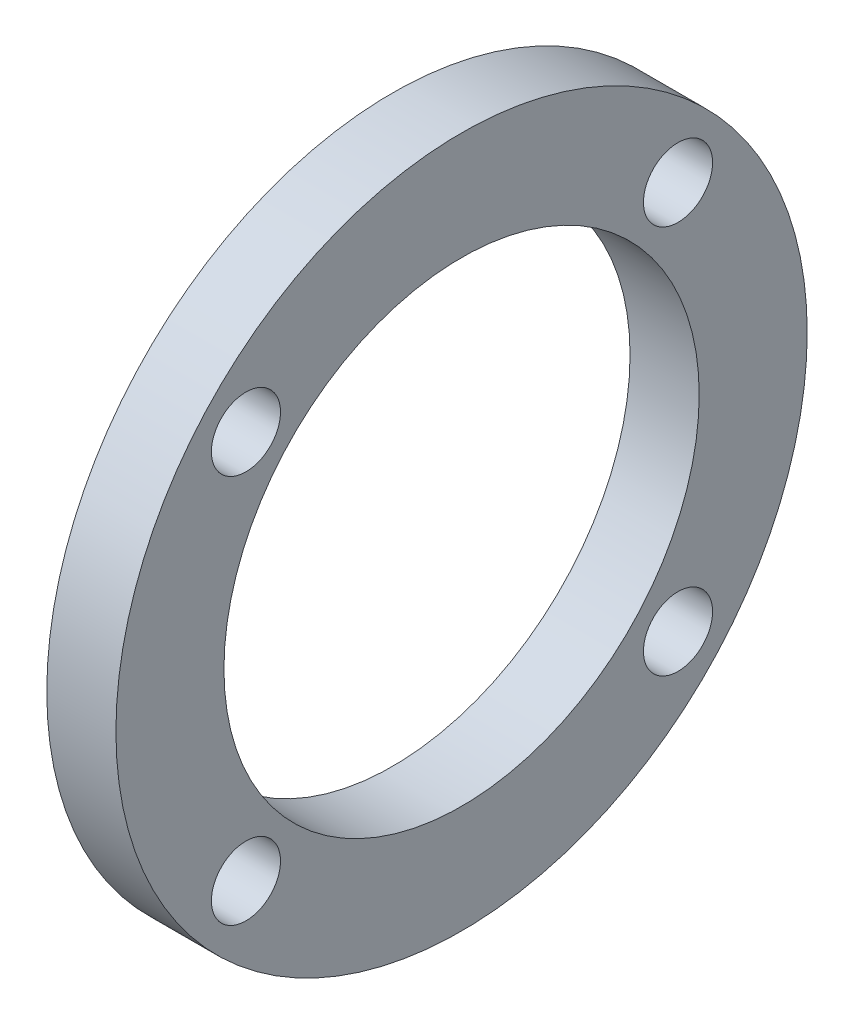
ISO-10303-21;
HEADER;
FILE_DESCRIPTION(('STEP AP214'),'2;1');
FILE_NAME('part.step','',(''),(''),'','','');
FILE_SCHEMA(('AUTOMOTIVE_DESIGN { 1 0 10303 214 1 1 1 1 }'));
ENDSEC;
DATA;
#1=APPLICATION_CONTEXT('core data for automotive mechanical design processes');
#2=APPLICATION_PROTOCOL_DEFINITION('international standard','automotive_design',2000,#1);
#3=PRODUCT_CONTEXT('',#1,'mechanical');
#4=PRODUCT('Part','Part','',(#3));
#5=PRODUCT_RELATED_PRODUCT_CATEGORY('part','',(#4));
#6=PRODUCT_DEFINITION_FORMATION('','',#4);
#7=PRODUCT_DEFINITION_CONTEXT('part definition',#1,'design');
#8=PRODUCT_DEFINITION('design','',#6,#7);
#9=PRODUCT_DEFINITION_SHAPE('','',#8);
#10=(LENGTH_UNIT() NAMED_UNIT(*) SI_UNIT(.MILLI.,.METRE.));
#11=(NAMED_UNIT(*) PLANE_ANGLE_UNIT() SI_UNIT($,.RADIAN.));
#12=(NAMED_UNIT(*) SI_UNIT($,.STERADIAN.) SOLID_ANGLE_UNIT());
#13=UNCERTAINTY_MEASURE_WITH_UNIT(LENGTH_MEASURE(1.E-05),#10,'distance_accuracy_value','');
#14=(GEOMETRIC_REPRESENTATION_CONTEXT(3) GLOBAL_UNCERTAINTY_ASSIGNED_CONTEXT((#13)) GLOBAL_UNIT_ASSIGNED_CONTEXT((#10,
#11,#12)) REPRESENTATION_CONTEXT('',''));
#15=CARTESIAN_POINT('',(0.,0.,0.));
#16=DIRECTION('',(0.,0.,1.));
#17=DIRECTION('',(1.,0.,0.));
#18=AXIS2_PLACEMENT_3D('',#15,#16,#17);
#19=CARTESIAN_POINT('',(8.,0.,0.));
#20=DIRECTION('',(1.,0.,0.));
#21=DIRECTION('',(0.,0.,-1.));
#22=AXIS2_PLACEMENT_3D('',#19,#20,#21);
#23=PLANE('',#22);
#24=CARTESIAN_POINT('',(8.,0.,0.));
#25=DIRECTION('',(1.,0.,0.));
#26=DIRECTION('',(0.,0.,-1.));
#27=AXIS2_PLACEMENT_3D('',#24,#25,#26);
#28=CIRCLE('',#27,27.5);
#29=CARTESIAN_POINT('',(8.,0.,-27.5));
#30=VERTEX_POINT('',#29);
#31=EDGE_CURVE('E87',#30,#30,#28,.T.);
#32=ORIENTED_EDGE('',*,*,#31,.F.);
#33=EDGE_LOOP('',(#32));
#34=FACE_BOUND('',#33,.T.);
#35=CARTESIAN_POINT('',(8.,22.5000000051948,-25.045842029834));
#36=DIRECTION('',(1.,0.,0.));
#37=DIRECTION('',(0.,0.,-1.));
#38=AXIS2_PLACEMENT_3D('',#35,#36,#37);
#39=CIRCLE('',#38,4.0000000015188);
#40=CARTESIAN_POINT('',(8.,22.5000000051948,-29.0458420313528));
#41=VERTEX_POINT('',#40);
#42=EDGE_CURVE('E72',#41,#41,#39,.F.);
#43=ORIENTED_EDGE('',*,*,#42,.T.);
#44=EDGE_LOOP('',(#43));
#45=FACE_BOUND('',#44,.T.);
#46=CARTESIAN_POINT('',(8.,22.5,24.954157970166));
#47=DIRECTION('',(1.,0.,0.));
#48=DIRECTION('',(0.,0.,-1.));
#49=AXIS2_PLACEMENT_3D('',#46,#47,#48);
#50=CIRCLE('',#49,4.);
#51=CARTESIAN_POINT('',(8.,22.5,20.954157970166));
#52=VERTEX_POINT('',#51);
#53=EDGE_CURVE('E55',#52,#52,#50,.F.);
#54=ORIENTED_EDGE('',*,*,#53,.T.);
#55=EDGE_LOOP('',(#54));
#56=FACE_BOUND('',#55,.T.);
#57=CARTESIAN_POINT('',(8.,0.,0.));
#58=DIRECTION('',(1.,0.,0.));
#59=DIRECTION('',(0.,0.,-1.));
#60=AXIS2_PLACEMENT_3D('',#57,#58,#59);
#61=CIRCLE('',#60,40.);
#62=CARTESIAN_POINT('',(8.,0.,-40.));
#63=VERTEX_POINT('',#62);
#64=EDGE_CURVE('E10',#63,#63,#61,.T.);
#65=ORIENTED_EDGE('',*,*,#64,.T.);
#66=EDGE_LOOP('',(#65));
#67=FACE_BOUND('',#66,.T.);
#68=CARTESIAN_POINT('',(8.,-22.5000000051948,-25.045842029834));
#69=DIRECTION('',(1.,0.,0.));
#70=DIRECTION('',(0.,0.,-1.));
#71=AXIS2_PLACEMENT_3D('',#68,#69,#70);
#72=CIRCLE('',#71,4.0000000015188);
#73=CARTESIAN_POINT('',(8.,-22.5000000051948,-29.0458420313528));
#74=VERTEX_POINT('',#73);
#75=EDGE_CURVE('E79',#74,#74,#72,.T.);
#76=ORIENTED_EDGE('',*,*,#75,.F.);
#77=EDGE_LOOP('',(#76));
#78=FACE_BOUND('',#77,.T.);
#79=CARTESIAN_POINT('',(8.,-22.5,24.954157970166));
#80=DIRECTION('',(1.,0.,0.));
#81=DIRECTION('',(0.,0.,-1.));
#82=AXIS2_PLACEMENT_3D('',#79,#80,#81);
#83=CIRCLE('',#82,4.);
#84=CARTESIAN_POINT('',(8.,-22.5,20.954157970166));
#85=VERTEX_POINT('',#84);
#86=EDGE_CURVE('E63',#85,#85,#83,.T.);
#87=ORIENTED_EDGE('',*,*,#86,.F.);
#88=EDGE_LOOP('',(#87));
#89=FACE_BOUND('',#88,.T.);
#90=ADVANCED_FACE('F40',(#34,#45,#56,#67,#78,#89),#23,.T.);
#91=CARTESIAN_POINT('',(0.,0.,0.));
#92=DIRECTION('',(1.,0.,0.));
#93=DIRECTION('',(0.,0.,-1.));
#94=AXIS2_PLACEMENT_3D('',#91,#92,#93);
#95=PLANE('',#94);
#96=CARTESIAN_POINT('',(0.,0.,0.));
#97=DIRECTION('',(1.,0.,0.));
#98=DIRECTION('',(0.,0.,-1.));
#99=AXIS2_PLACEMENT_3D('',#96,#97,#98);
#100=CIRCLE('',#99,27.5);
#101=CARTESIAN_POINT('',(0.,0.,-27.5));
#102=VERTEX_POINT('',#101);
#103=EDGE_CURVE('E83',#102,#102,#100,.T.);
#104=ORIENTED_EDGE('',*,*,#103,.T.);
#105=EDGE_LOOP('',(#104));
#106=FACE_BOUND('',#105,.T.);
#107=CARTESIAN_POINT('',(0.,22.5000000051948,-25.045842029834));
#108=DIRECTION('',(1.,0.,0.));
#109=DIRECTION('',(0.,0.,-1.));
#110=AXIS2_PLACEMENT_3D('',#107,#108,#109);
#111=CIRCLE('',#110,4.0000000015188);
#112=CARTESIAN_POINT('',(0.,22.5000000051948,-29.0458420313528));
#113=VERTEX_POINT('',#112);
#114=EDGE_CURVE('E59',#113,#113,#111,.F.);
#115=ORIENTED_EDGE('',*,*,#114,.F.);
#116=EDGE_LOOP('',(#115));
#117=FACE_BOUND('',#116,.T.);
#118=CARTESIAN_POINT('',(0.,-22.5000000051948,-25.045842029834));
#119=DIRECTION('',(1.,0.,0.));
#120=DIRECTION('',(0.,0.,-1.));
#121=AXIS2_PLACEMENT_3D('',#118,#119,#120);
#122=CIRCLE('',#121,4.0000000015188);
#123=CARTESIAN_POINT('',(0.,-22.5000000051948,-29.0458420313528));
#124=VERTEX_POINT('',#123);
#125=EDGE_CURVE('E68',#124,#124,#122,.T.);
#126=ORIENTED_EDGE('',*,*,#125,.T.);
#127=EDGE_LOOP('',(#126));
#128=FACE_BOUND('',#127,.T.);
#129=CARTESIAN_POINT('',(0.,22.5,24.954157970166));
#130=DIRECTION('',(1.,0.,0.));
#131=DIRECTION('',(0.,0.,-1.));
#132=AXIS2_PLACEMENT_3D('',#129,#130,#131);
#133=CIRCLE('',#132,4.);
#134=CARTESIAN_POINT('',(0.,22.5,20.954157970166));
#135=VERTEX_POINT('',#134);
#136=EDGE_CURVE('E53',#135,#135,#133,.F.);
#137=ORIENTED_EDGE('',*,*,#136,.F.);
#138=EDGE_LOOP('',(#137));
#139=FACE_BOUND('',#138,.T.);
#140=CARTESIAN_POINT('',(0.,0.,0.));
#141=DIRECTION('',(1.,0.,0.));
#142=DIRECTION('',(0.,0.,-1.));
#143=AXIS2_PLACEMENT_3D('',#140,#141,#142);
#144=CIRCLE('',#143,40.);
#145=CARTESIAN_POINT('',(0.,0.,-40.));
#146=VERTEX_POINT('',#145);
#147=EDGE_CURVE('E44',#146,#146,#144,.T.);
#148=ORIENTED_EDGE('',*,*,#147,.F.);
#149=EDGE_LOOP('',(#148));
#150=FACE_BOUND('',#149,.T.);
#151=CARTESIAN_POINT('',(0.,-22.5,24.954157970166));
#152=DIRECTION('',(1.,0.,0.));
#153=DIRECTION('',(0.,0.,-1.));
#154=AXIS2_PLACEMENT_3D('',#151,#152,#153);
#155=CIRCLE('',#154,4.);
#156=CARTESIAN_POINT('',(0.,-22.5,20.954157970166));
#157=VERTEX_POINT('',#156);
#158=EDGE_CURVE('E67',#157,#157,#155,.T.);
#159=ORIENTED_EDGE('',*,*,#158,.T.);
#160=EDGE_LOOP('',(#159));
#161=FACE_BOUND('',#160,.T.);
#162=ADVANCED_FACE('F95',(#106,#117,#128,#139,#150,#161),#95,.F.);
#163=CARTESIAN_POINT('',(8.,0.,0.));
#164=DIRECTION('',(-1.,0.,0.));
#165=DIRECTION('',(0.,0.,1.));
#166=AXIS2_PLACEMENT_3D('',#163,#164,#165);
#167=CYLINDRICAL_SURFACE('',#166,40.);
#168=ORIENTED_EDGE('',*,*,#64,.F.);
#169=EDGE_LOOP('',(#168));
#170=FACE_BOUND('',#169,.T.);
#171=ORIENTED_EDGE('',*,*,#147,.T.);
#172=EDGE_LOOP('',(#171));
#173=FACE_BOUND('',#172,.T.);
#174=ADVANCED_FACE('F42',(#170,#173),#167,.T.);
#175=CARTESIAN_POINT('',(0.,22.5,24.954157970166));
#176=DIRECTION('',(1.,0.,0.));
#177=DIRECTION('',(0.,0.,-1.));
#178=AXIS2_PLACEMENT_3D('',#175,#176,#177);
#179=CYLINDRICAL_SURFACE('',#178,4.);
#180=ORIENTED_EDGE('',*,*,#136,.T.);
#181=EDGE_LOOP('',(#180));
#182=FACE_BOUND('',#181,.T.);
#183=ORIENTED_EDGE('',*,*,#53,.F.);
#184=EDGE_LOOP('',(#183));
#185=FACE_BOUND('',#184,.T.);
#186=ADVANCED_FACE('F127',(#182,#185),#179,.F.);
#187=CARTESIAN_POINT('',(0.,-22.5000000051948,-25.045842029834));
#188=DIRECTION('',(1.,0.,0.));
#189=DIRECTION('',(0.,0.,-1.));
#190=AXIS2_PLACEMENT_3D('',#187,#188,#189);
#191=CYLINDRICAL_SURFACE('',#190,4.0000000015188);
#192=ORIENTED_EDGE('',*,*,#125,.F.);
#193=EDGE_LOOP('',(#192));
#194=FACE_BOUND('',#193,.T.);
#195=ORIENTED_EDGE('',*,*,#75,.T.);
#196=EDGE_LOOP('',(#195));
#197=FACE_BOUND('',#196,.T.);
#198=ADVANCED_FACE('F118',(#194,#197),#191,.F.);
#199=CARTESIAN_POINT('',(0.,-22.5,24.954157970166));
#200=DIRECTION('',(1.,0.,0.));
#201=DIRECTION('',(0.,0.,-1.));
#202=AXIS2_PLACEMENT_3D('',#199,#200,#201);
#203=CYLINDRICAL_SURFACE('',#202,4.);
#204=ORIENTED_EDGE('',*,*,#158,.F.);
#205=EDGE_LOOP('',(#204));
#206=FACE_BOUND('',#205,.T.);
#207=ORIENTED_EDGE('',*,*,#86,.T.);
#208=EDGE_LOOP('',(#207));
#209=FACE_BOUND('',#208,.T.);
#210=ADVANCED_FACE('F116',(#206,#209),#203,.F.);
#211=CARTESIAN_POINT('',(0.,22.5000000051948,-25.045842029834));
#212=DIRECTION('',(1.,0.,0.));
#213=DIRECTION('',(0.,0.,-1.));
#214=AXIS2_PLACEMENT_3D('',#211,#212,#213);
#215=CYLINDRICAL_SURFACE('',#214,4.0000000015188);
#216=ORIENTED_EDGE('',*,*,#114,.T.);
#217=EDGE_LOOP('',(#216));
#218=FACE_BOUND('',#217,.T.);
#219=ORIENTED_EDGE('',*,*,#42,.F.);
#220=EDGE_LOOP('',(#219));
#221=FACE_BOUND('',#220,.T.);
#222=ADVANCED_FACE('F101',(#218,#221),#215,.F.);
#223=CARTESIAN_POINT('',(0.,0.,0.));
#224=DIRECTION('',(1.,0.,0.));
#225=DIRECTION('',(0.,0.,-1.));
#226=AXIS2_PLACEMENT_3D('',#223,#224,#225);
#227=CYLINDRICAL_SURFACE('',#226,27.5);
#228=ORIENTED_EDGE('',*,*,#103,.F.);
#229=EDGE_LOOP('',(#228));
#230=FACE_BOUND('',#229,.T.);
#231=ORIENTED_EDGE('',*,*,#31,.T.);
#232=EDGE_LOOP('',(#231));
#233=FACE_BOUND('',#232,.T.);
#234=ADVANCED_FACE('F98',(#230,#233),#227,.F.);
#235=CLOSED_SHELL('',(#90,#162,#174,#186,#198,#210,#222,#234));
#236=MANIFOLD_SOLID_BREP('B2',#235);
#237=ADVANCED_BREP_SHAPE_REPRESENTATION('',(#18,#236),#14);
#238=SHAPE_DEFINITION_REPRESENTATION(#9,#237);
ENDSEC;
END-ISO-10303-21;
